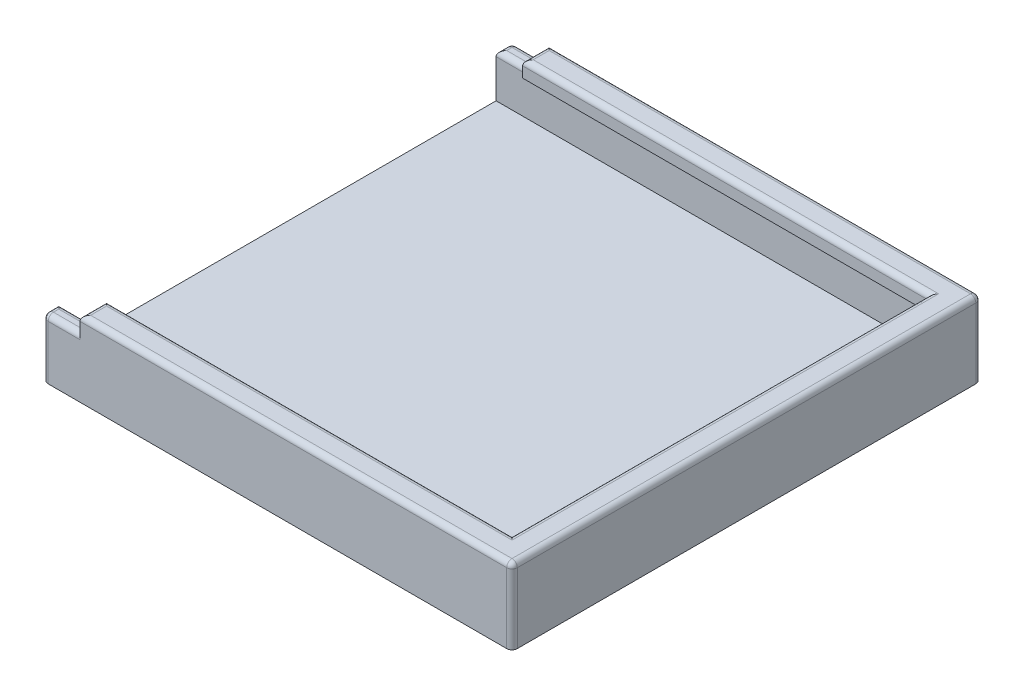
ISO-10303-21;
HEADER;
FILE_DESCRIPTION(('STEP AP214'),'2;1');
FILE_NAME('part.step','',(''),(''),'','','');
FILE_SCHEMA(('AUTOMOTIVE_DESIGN { 1 0 10303 214 1 1 1 1 }'));
ENDSEC;
DATA;
#1=APPLICATION_CONTEXT('core data for automotive mechanical design processes');
#2=APPLICATION_PROTOCOL_DEFINITION('international standard','automotive_design',2000,#1);
#3=PRODUCT_CONTEXT('',#1,'mechanical');
#4=PRODUCT('Part','Part','',(#3));
#5=PRODUCT_RELATED_PRODUCT_CATEGORY('part','',(#4));
#6=PRODUCT_DEFINITION_FORMATION('','',#4);
#7=PRODUCT_DEFINITION_CONTEXT('part definition',#1,'design');
#8=PRODUCT_DEFINITION('design','',#6,#7);
#9=PRODUCT_DEFINITION_SHAPE('','',#8);
#10=(LENGTH_UNIT() NAMED_UNIT(*) SI_UNIT(.MILLI.,.METRE.));
#11=(NAMED_UNIT(*) PLANE_ANGLE_UNIT() SI_UNIT($,.RADIAN.));
#12=(NAMED_UNIT(*) SI_UNIT($,.STERADIAN.) SOLID_ANGLE_UNIT());
#13=UNCERTAINTY_MEASURE_WITH_UNIT(LENGTH_MEASURE(1.E-05),#10,'distance_accuracy_value','');
#14=(GEOMETRIC_REPRESENTATION_CONTEXT(3) GLOBAL_UNCERTAINTY_ASSIGNED_CONTEXT((#13)) GLOBAL_UNIT_ASSIGNED_CONTEXT((#10,
#11,#12)) REPRESENTATION_CONTEXT('',''));
#15=CARTESIAN_POINT('',(0.,0.,0.));
#16=DIRECTION('',(0.,0.,1.));
#17=DIRECTION('',(1.,0.,0.));
#18=AXIS2_PLACEMENT_3D('',#15,#16,#17);
#19=CARTESIAN_POINT('',(0.,4.1,0.));
#20=DIRECTION('',(0.,1.,0.));
#21=DIRECTION('',(0.,0.,1.));
#22=AXIS2_PLACEMENT_3D('',#19,#20,#21);
#23=PLANE('',#22);
#24=DIRECTION('',(0.,0.,-1.));
#25=VECTOR('',#24,1.);
#26=CARTESIAN_POINT('',(-18.6,4.1,-20.6));
#27=LINE('',#26,#25);
#28=CARTESIAN_POINT('',(-18.6,4.1,-21.1));
#29=VERTEX_POINT('',#28);
#30=CARTESIAN_POINT('',(-18.6,4.1,-21.6));
#31=VERTEX_POINT('',#30);
#32=EDGE_CURVE('E274',#29,#31,#27,.T.);
#33=ORIENTED_EDGE('',*,*,#32,.T.);
#34=DIRECTION('',(-1.,0.,0.));
#35=VECTOR('',#34,1.);
#36=CARTESIAN_POINT('',(-22.1,4.1,-21.6));
#37=LINE('',#36,#35);
#38=CARTESIAN_POINT('',(-21.6,4.1,-21.6));
#39=VERTEX_POINT('',#38);
#40=EDGE_CURVE('E392',#31,#39,#37,.T.);
#41=ORIENTED_EDGE('',*,*,#40,.T.);
#42=DIRECTION('',(0.,0.,1.));
#43=VECTOR('',#42,1.);
#44=CARTESIAN_POINT('',(-21.6,4.1,0.));
#45=LINE('',#44,#43);
#46=CARTESIAN_POINT('',(-21.6,4.1,-21.1));
#47=VERTEX_POINT('',#46);
#48=EDGE_CURVE('E390',#39,#47,#45,.T.);
#49=ORIENTED_EDGE('',*,*,#48,.T.);
#50=DIRECTION('',(-1.,0.,0.));
#51=VECTOR('',#50,1.);
#52=CARTESIAN_POINT('',(0.,4.1,-21.1));
#53=LINE('',#52,#51);
#54=EDGE_CURVE('E388',#47,#29,#53,.F.);
#55=ORIENTED_EDGE('',*,*,#54,.T.);
#56=EDGE_LOOP('',(#33,#41,#49,#55));
#57=FACE_BOUND('',#56,.T.);
#58=ADVANCED_FACE('F37',(#57),#23,.T.);
#59=DIRECTION('',(0.,0.,1.));
#60=VECTOR('',#59,1.);
#61=CARTESIAN_POINT('',(-21.6,4.1,0.));
#62=LINE('',#61,#60);
#63=CARTESIAN_POINT('',(-21.6,4.1,21.1));
#64=VERTEX_POINT('',#63);
#65=CARTESIAN_POINT('',(-21.6,4.1,21.6));
#66=VERTEX_POINT('',#65);
#67=EDGE_CURVE('E380',#64,#66,#62,.T.);
#68=ORIENTED_EDGE('',*,*,#67,.T.);
#69=DIRECTION('',(1.,0.,0.));
#70=VECTOR('',#69,1.);
#71=CARTESIAN_POINT('',(0.,4.1,21.6));
#72=LINE('',#71,#70);
#73=CARTESIAN_POINT('',(-18.6,4.1,21.6));
#74=VERTEX_POINT('',#73);
#75=EDGE_CURVE('E382',#66,#74,#72,.T.);
#76=ORIENTED_EDGE('',*,*,#75,.T.);
#77=DIRECTION('',(0.,0.,-1.));
#78=VECTOR('',#77,1.);
#79=CARTESIAN_POINT('',(-18.6,4.1,19.6));
#80=LINE('',#79,#78);
#81=CARTESIAN_POINT('',(-18.6,4.1,21.1));
#82=VERTEX_POINT('',#81);
#83=EDGE_CURVE('E262',#74,#82,#80,.T.);
#84=ORIENTED_EDGE('',*,*,#83,.T.);
#85=DIRECTION('',(1.,0.,0.));
#86=VECTOR('',#85,1.);
#87=CARTESIAN_POINT('',(0.,4.1,21.1));
#88=LINE('',#87,#86);
#89=EDGE_CURVE('E378',#82,#64,#88,.F.);
#90=ORIENTED_EDGE('',*,*,#89,.T.);
#91=EDGE_LOOP('',(#68,#76,#84,#90));
#92=FACE_BOUND('',#91,.T.);
#93=ADVANCED_FACE('F568',(#92),#23,.T.);
#94=CARTESIAN_POINT('',(19.6,5.6,-22.1));
#95=DIRECTION('',(1.,0.,0.));
#96=DIRECTION('',(0.,0.,-1.));
#97=AXIS2_PLACEMENT_3D('',#94,#95,#96);
#98=PLANE('',#97);
#99=DIRECTION('',(0.,-1.,0.));
#100=VECTOR('',#99,1.);
#101=CARTESIAN_POINT('',(19.6,5.6,19.6));
#102=LINE('',#101,#100);
#103=CARTESIAN_POINT('',(19.6,5.1,19.6));
#104=VERTEX_POINT('',#103);
#105=CARTESIAN_POINT('',(19.6,4.1,19.6));
#106=VERTEX_POINT('',#105);
#107=EDGE_CURVE('E243',#104,#106,#102,.T.);
#108=ORIENTED_EDGE('',*,*,#107,.F.);
#109=DIRECTION('',(0.,0.,1.));
#110=VECTOR('',#109,1.);
#111=CARTESIAN_POINT('',(19.6,5.1,-22.1));
#112=LINE('',#111,#110);
#113=CARTESIAN_POINT('',(19.6,5.1,-19.6));
#114=VERTEX_POINT('',#113);
#115=EDGE_CURVE('E337',#104,#114,#112,.F.);
#116=ORIENTED_EDGE('',*,*,#115,.T.);
#117=DIRECTION('',(0.,1.,0.));
#118=VECTOR('',#117,1.);
#119=CARTESIAN_POINT('',(19.6,5.59999999999999,-19.6));
#120=LINE('',#119,#118);
#121=CARTESIAN_POINT('',(19.6,4.1,-19.6));
#122=VERTEX_POINT('',#121);
#123=EDGE_CURVE('E264',#122,#114,#120,.T.);
#124=ORIENTED_EDGE('',*,*,#123,.F.);
#125=DIRECTION('',(0.,0.,1.));
#126=VECTOR('',#125,1.);
#127=CARTESIAN_POINT('',(19.6,4.1,-22.1));
#128=LINE('',#127,#126);
#129=EDGE_CURVE('E282',#122,#106,#128,.T.);
#130=ORIENTED_EDGE('',*,*,#129,.T.);
#131=EDGE_LOOP('',(#108,#116,#124,#130));
#132=FACE_BOUND('',#131,.T.);
#133=ADVANCED_FACE('F480',(#132),#98,.F.);
#134=CARTESIAN_POINT('',(-22.1,-1.5,-22.1));
#135=DIRECTION('',(0.,0.,1.));
#136=DIRECTION('',(1.,0.,0.));
#137=AXIS2_PLACEMENT_3D('',#134,#135,#136);
#138=PLANE('',#137);
#139=DIRECTION('',(0.,1.,0.));
#140=VECTOR('',#139,1.);
#141=CARTESIAN_POINT('',(-18.6,5.6,-22.1));
#142=LINE('',#141,#140);
#143=CARTESIAN_POINT('',(-18.6,3.6,-22.1));
#144=VERTEX_POINT('',#143);
#145=CARTESIAN_POINT('',(-18.6,5.1,-22.1));
#146=VERTEX_POINT('',#145);
#147=EDGE_CURVE('E279',#144,#146,#142,.T.);
#148=ORIENTED_EDGE('',*,*,#147,.T.);
#149=DIRECTION('',(-1.,0.,0.));
#150=VECTOR('',#149,1.);
#151=CARTESIAN_POINT('',(-22.1,5.1,-22.1));
#152=LINE('',#151,#150);
#153=CARTESIAN_POINT('',(21.6,5.1,-22.1));
#154=VERTEX_POINT('',#153);
#155=EDGE_CURVE('E347',#146,#154,#152,.F.);
#156=ORIENTED_EDGE('',*,*,#155,.T.);
#157=DIRECTION('',(0.,1.,0.));
#158=VECTOR('',#157,1.);
#159=CARTESIAN_POINT('',(21.6,-1.5,-22.1));
#160=LINE('',#159,#158);
#161=CARTESIAN_POINT('',(21.6,-1.5,-22.1));
#162=VERTEX_POINT('',#161);
#163=EDGE_CURVE('E345',#154,#162,#160,.F.);
#164=ORIENTED_EDGE('',*,*,#163,.T.);
#165=DIRECTION('',(1.,0.,0.));
#166=VECTOR('',#165,1.);
#167=CARTESIAN_POINT('',(-22.1,-1.5,-22.1));
#168=LINE('',#167,#166);
#169=CARTESIAN_POINT('',(-21.6,-1.5,-22.1));
#170=VERTEX_POINT('',#169);
#171=EDGE_CURVE('E300',#170,#162,#168,.T.);
#172=ORIENTED_EDGE('',*,*,#171,.F.);
#173=DIRECTION('',(0.,1.,0.));
#174=VECTOR('',#173,1.);
#175=CARTESIAN_POINT('',(-21.6,4.1,-22.1));
#176=LINE('',#175,#174);
#177=CARTESIAN_POINT('',(-21.6,3.6,-22.1));
#178=VERTEX_POINT('',#177);
#179=EDGE_CURVE('E342',#170,#178,#176,.T.);
#180=ORIENTED_EDGE('',*,*,#179,.T.);
#181=DIRECTION('',(-1.,0.,0.));
#182=VECTOR('',#181,1.);
#183=CARTESIAN_POINT('',(-18.6,3.6,-22.1));
#184=LINE('',#183,#182);
#185=EDGE_CURVE('E339',#178,#144,#184,.F.);
#186=ORIENTED_EDGE('',*,*,#185,.T.);
#187=EDGE_LOOP('',(#148,#156,#164,#172,#180,#186));
#188=FACE_BOUND('',#187,.T.);
#189=ADVANCED_FACE('F508',(#188),#138,.F.);
#190=CARTESIAN_POINT('',(22.1,-1.5,-22.1));
#191=DIRECTION('',(-1.,0.,0.));
#192=DIRECTION('',(0.,0.,1.));
#193=AXIS2_PLACEMENT_3D('',#190,#191,#192);
#194=PLANE('',#193);
#195=DIRECTION('',(0.,0.,1.));
#196=VECTOR('',#195,1.);
#197=CARTESIAN_POINT('',(22.1,-1.5,-22.1));
#198=LINE('',#197,#196);
#199=CARTESIAN_POINT('',(22.1,-1.5,-21.6));
#200=VERTEX_POINT('',#199);
#201=CARTESIAN_POINT('',(22.1,-1.5,21.6));
#202=VERTEX_POINT('',#201);
#203=EDGE_CURVE('E303',#200,#202,#198,.T.);
#204=ORIENTED_EDGE('',*,*,#203,.F.);
#205=DIRECTION('',(0.,1.,0.));
#206=VECTOR('',#205,1.);
#207=CARTESIAN_POINT('',(22.1,-1.5,-21.6));
#208=LINE('',#207,#206);
#209=CARTESIAN_POINT('',(22.1,5.1,-21.6));
#210=VERTEX_POINT('',#209);
#211=EDGE_CURVE('E376',#200,#210,#208,.T.);
#212=ORIENTED_EDGE('',*,*,#211,.T.);
#213=DIRECTION('',(0.,0.,-1.));
#214=VECTOR('',#213,1.);
#215=CARTESIAN_POINT('',(22.1,5.1,-22.1));
#216=LINE('',#215,#214);
#217=CARTESIAN_POINT('',(22.1,5.1,21.6));
#218=VERTEX_POINT('',#217);
#219=EDGE_CURVE('E372',#210,#218,#216,.F.);
#220=ORIENTED_EDGE('',*,*,#219,.T.);
#221=DIRECTION('',(0.,1.,0.));
#222=VECTOR('',#221,1.);
#223=CARTESIAN_POINT('',(22.1,-1.5,21.6));
#224=LINE('',#223,#222);
#225=EDGE_CURVE('E374',#218,#202,#224,.F.);
#226=ORIENTED_EDGE('',*,*,#225,.T.);
#227=EDGE_LOOP('',(#204,#212,#220,#226));
#228=FACE_BOUND('',#227,.T.);
#229=ADVANCED_FACE('F581',(#228),#194,.F.);
#230=CARTESIAN_POINT('',(-22.1,-1.5,22.1));
#231=DIRECTION('',(0.,0.,1.));
#232=DIRECTION('',(1.,0.,0.));
#233=AXIS2_PLACEMENT_3D('',#230,#231,#232);
#234=PLANE('',#233);
#235=DIRECTION('',(1.,0.,0.));
#236=VECTOR('',#235,1.);
#237=CARTESIAN_POINT('',(-22.1,-1.5,22.1));
#238=LINE('',#237,#236);
#239=CARTESIAN_POINT('',(-21.6,-1.5,22.1));
#240=VERTEX_POINT('',#239);
#241=CARTESIAN_POINT('',(21.6,-1.5,22.1));
#242=VERTEX_POINT('',#241);
#243=EDGE_CURVE('E306',#240,#242,#238,.T.);
#244=ORIENTED_EDGE('',*,*,#243,.T.);
#245=DIRECTION('',(0.,1.,0.));
#246=VECTOR('',#245,1.);
#247=CARTESIAN_POINT('',(21.6,5.6,22.1));
#248=LINE('',#247,#246);
#249=CARTESIAN_POINT('',(21.6,5.1,22.1));
#250=VERTEX_POINT('',#249);
#251=EDGE_CURVE('E370',#242,#250,#248,.T.);
#252=ORIENTED_EDGE('',*,*,#251,.T.);
#253=DIRECTION('',(1.,0.,0.));
#254=VECTOR('',#253,1.);
#255=CARTESIAN_POINT('',(-18.6,5.1,22.1));
#256=LINE('',#255,#254);
#257=CARTESIAN_POINT('',(-18.6,5.1,22.1));
#258=VERTEX_POINT('',#257);
#259=EDGE_CURVE('E368',#250,#258,#256,.F.);
#260=ORIENTED_EDGE('',*,*,#259,.T.);
#261=DIRECTION('',(0.,-1.,0.));
#262=VECTOR('',#261,1.);
#263=CARTESIAN_POINT('',(-18.6,4.1,22.1));
#264=LINE('',#263,#262);
#265=CARTESIAN_POINT('',(-18.6,3.6,22.1));
#266=VERTEX_POINT('',#265);
#267=EDGE_CURVE('E261',#258,#266,#264,.T.);
#268=ORIENTED_EDGE('',*,*,#267,.T.);
#269=DIRECTION('',(1.,0.,0.));
#270=VECTOR('',#269,1.);
#271=CARTESIAN_POINT('',(-22.1,3.6,22.1));
#272=LINE('',#271,#270);
#273=CARTESIAN_POINT('',(-21.6,3.6,22.1));
#274=VERTEX_POINT('',#273);
#275=EDGE_CURVE('E364',#266,#274,#272,.F.);
#276=ORIENTED_EDGE('',*,*,#275,.T.);
#277=DIRECTION('',(0.,1.,0.));
#278=VECTOR('',#277,1.);
#279=CARTESIAN_POINT('',(-21.6,-1.5,22.1));
#280=LINE('',#279,#278);
#281=EDGE_CURVE('E366',#274,#240,#280,.F.);
#282=ORIENTED_EDGE('',*,*,#281,.T.);
#283=EDGE_LOOP('',(#244,#252,#260,#268,#276,#282));
#284=FACE_BOUND('',#283,.T.);
#285=ADVANCED_FACE('F578',(#284),#234,.T.);
#286=CARTESIAN_POINT('',(-22.1,-1.5,-22.1));
#287=DIRECTION('',(-1.,0.,0.));
#288=DIRECTION('',(0.,0.,1.));
#289=AXIS2_PLACEMENT_3D('',#286,#287,#288);
#290=PLANE('',#289);
#291=DIRECTION('',(0.,0.,1.));
#292=VECTOR('',#291,1.);
#293=CARTESIAN_POINT('',(-22.1,-1.5,-22.1));
#294=LINE('',#293,#292);
#295=CARTESIAN_POINT('',(-22.1,-1.5,-21.6));
#296=VERTEX_POINT('',#295);
#297=CARTESIAN_POINT('',(-22.1,-1.5,21.6));
#298=VERTEX_POINT('',#297);
#299=EDGE_CURVE('E309',#296,#298,#294,.T.);
#300=ORIENTED_EDGE('',*,*,#299,.T.);
#301=DIRECTION('',(0.,1.,0.));
#302=VECTOR('',#301,1.);
#303=CARTESIAN_POINT('',(-22.1,-1.5,21.6));
#304=LINE('',#303,#302);
#305=CARTESIAN_POINT('',(-22.1,3.6,21.6));
#306=VERTEX_POINT('',#305);
#307=EDGE_CURVE('E354',#298,#306,#304,.T.);
#308=ORIENTED_EDGE('',*,*,#307,.T.);
#309=DIRECTION('',(0.,0.,1.));
#310=VECTOR('',#309,1.);
#311=CARTESIAN_POINT('',(-22.1,3.6,-22.1));
#312=LINE('',#311,#310);
#313=CARTESIAN_POINT('',(-22.1,3.6,20.6));
#314=VERTEX_POINT('',#313);
#315=EDGE_CURVE('E250',#306,#314,#312,.F.);
#316=ORIENTED_EDGE('',*,*,#315,.T.);
#317=DIRECTION('',(0.,1.,0.));
#318=VECTOR('',#317,1.);
#319=CARTESIAN_POINT('',(-22.1,-1.5,20.6));
#320=LINE('',#319,#318);
#321=CARTESIAN_POINT('',(-22.1,0.,20.6));
#322=VERTEX_POINT('',#321);
#323=EDGE_CURVE('E227',#322,#314,#320,.T.);
#324=ORIENTED_EDGE('',*,*,#323,.F.);
#325=DIRECTION('',(0.,0.,1.));
#326=VECTOR('',#325,1.);
#327=CARTESIAN_POINT('',(-22.1,0.,-22.1));
#328=LINE('',#327,#326);
#329=CARTESIAN_POINT('',(-22.1,0.,-20.6));
#330=VERTEX_POINT('',#329);
#331=EDGE_CURVE('E239',#330,#322,#328,.T.);
#332=ORIENTED_EDGE('',*,*,#331,.F.);
#333=DIRECTION('',(0.,-1.,0.));
#334=VECTOR('',#333,1.);
#335=CARTESIAN_POINT('',(-22.1,-1.5,-20.6));
#336=LINE('',#335,#334);
#337=CARTESIAN_POINT('',(-22.1,3.6,-20.6));
#338=VERTEX_POINT('',#337);
#339=EDGE_CURVE('E244',#338,#330,#336,.T.);
#340=ORIENTED_EDGE('',*,*,#339,.F.);
#341=DIRECTION('',(0.,0.,1.));
#342=VECTOR('',#341,1.);
#343=CARTESIAN_POINT('',(-22.1,3.6,-22.1));
#344=LINE('',#343,#342);
#345=CARTESIAN_POINT('',(-22.1,3.6,-21.6));
#346=VERTEX_POINT('',#345);
#347=EDGE_CURVE('E349',#338,#346,#344,.F.);
#348=ORIENTED_EDGE('',*,*,#347,.T.);
#349=DIRECTION('',(0.,1.,0.));
#350=VECTOR('',#349,1.);
#351=CARTESIAN_POINT('',(-22.1,-1.5,-21.6));
#352=LINE('',#351,#350);
#353=EDGE_CURVE('E351',#346,#296,#352,.F.);
#354=ORIENTED_EDGE('',*,*,#353,.T.);
#355=EDGE_LOOP('',(#300,#308,#316,#324,#332,#340,#348,#354));
#356=FACE_BOUND('',#355,.T.);
#357=ADVANCED_FACE('F247',(#356),#290,.T.);
#358=CARTESIAN_POINT('',(0.,-1.5,0.));
#359=DIRECTION('',(0.,-1.,0.));
#360=DIRECTION('',(0.,0.,-1.));
#361=AXIS2_PLACEMENT_3D('',#358,#359,#360);
#362=PLANE('',#361);
#363=ORIENTED_EDGE('',*,*,#299,.F.);
#364=CARTESIAN_POINT('',(-21.6,-1.5,-21.6));
#365=DIRECTION('',(0.,-1.,0.));
#366=DIRECTION('',(0.,0.,-1.));
#367=AXIS2_PLACEMENT_3D('',#364,#365,#366);
#368=CIRCLE('',#367,0.5);
#369=EDGE_CURVE('E362',#296,#170,#368,.T.);
#370=ORIENTED_EDGE('',*,*,#369,.T.);
#371=ORIENTED_EDGE('',*,*,#171,.T.);
#372=CARTESIAN_POINT('',(21.6,-1.5,-21.6));
#373=DIRECTION('',(0.,-1.,0.));
#374=DIRECTION('',(0.,0.,-1.));
#375=AXIS2_PLACEMENT_3D('',#372,#373,#374);
#376=CIRCLE('',#375,0.5);
#377=EDGE_CURVE('E358',#162,#200,#376,.T.);
#378=ORIENTED_EDGE('',*,*,#377,.T.);
#379=ORIENTED_EDGE('',*,*,#203,.T.);
#380=CARTESIAN_POINT('',(21.6,-1.5,21.6));
#381=DIRECTION('',(0.,-1.,0.));
#382=DIRECTION('',(0.,0.,-1.));
#383=AXIS2_PLACEMENT_3D('',#380,#381,#382);
#384=CIRCLE('',#383,0.5);
#385=EDGE_CURVE('E356',#202,#242,#384,.T.);
#386=ORIENTED_EDGE('',*,*,#385,.T.);
#387=ORIENTED_EDGE('',*,*,#243,.F.);
#388=CARTESIAN_POINT('',(-21.6,-1.5,21.6));
#389=DIRECTION('',(0.,-1.,0.));
#390=DIRECTION('',(0.,0.,-1.));
#391=AXIS2_PLACEMENT_3D('',#388,#389,#390);
#392=CIRCLE('',#391,0.5);
#393=EDGE_CURVE('E360',#240,#298,#392,.T.);
#394=ORIENTED_EDGE('',*,*,#393,.T.);
#395=EDGE_LOOP('',(#363,#370,#371,#378,#379,#386,#387,#394));
#396=FACE_BOUND('',#395,.T.);
#397=ADVANCED_FACE('F528',(#396),#362,.T.);
#398=CARTESIAN_POINT('',(20.6,4.1,-20.6));
#399=DIRECTION('',(-1.,0.,0.));
#400=DIRECTION('',(0.,0.,1.));
#401=AXIS2_PLACEMENT_3D('',#398,#399,#400);
#402=PLANE('',#401);
#403=DIRECTION('',(0.,0.,-1.));
#404=VECTOR('',#403,1.);
#405=CARTESIAN_POINT('',(20.6,0.,-20.6));
#406=LINE('',#405,#404);
#407=CARTESIAN_POINT('',(20.6,0.,20.6));
#408=VERTEX_POINT('',#407);
#409=CARTESIAN_POINT('',(20.6,0.,-20.6));
#410=VERTEX_POINT('',#409);
#411=EDGE_CURVE('E288',#408,#410,#406,.T.);
#412=ORIENTED_EDGE('',*,*,#411,.F.);
#413=DIRECTION('',(0.,-1.,0.));
#414=VECTOR('',#413,1.);
#415=CARTESIAN_POINT('',(20.6,4.1,20.6));
#416=LINE('',#415,#414);
#417=CARTESIAN_POINT('',(20.6,4.1,20.6));
#418=VERTEX_POINT('',#417);
#419=EDGE_CURVE('E230',#418,#408,#416,.T.);
#420=ORIENTED_EDGE('',*,*,#419,.F.);
#421=DIRECTION('',(0.,0.,-1.));
#422=VECTOR('',#421,1.);
#423=CARTESIAN_POINT('',(20.6,4.1,-20.6));
#424=LINE('',#423,#422);
#425=CARTESIAN_POINT('',(20.6,4.1,-20.6));
#426=VERTEX_POINT('',#425);
#427=EDGE_CURVE('E234',#418,#426,#424,.T.);
#428=ORIENTED_EDGE('',*,*,#427,.T.);
#429=DIRECTION('',(0.,-1.,0.));
#430=VECTOR('',#429,1.);
#431=CARTESIAN_POINT('',(20.6,4.1,-20.6));
#432=LINE('',#431,#430);
#433=EDGE_CURVE('E297',#426,#410,#432,.T.);
#434=ORIENTED_EDGE('',*,*,#433,.T.);
#435=EDGE_LOOP('',(#412,#420,#428,#434));
#436=FACE_BOUND('',#435,.T.);
#437=ADVANCED_FACE('F557',(#436),#402,.T.);
#438=CARTESIAN_POINT('',(-20.6,4.1,-20.6));
#439=DIRECTION('',(0.,0.,1.));
#440=DIRECTION('',(1.,0.,0.));
#441=AXIS2_PLACEMENT_3D('',#438,#439,#440);
#442=PLANE('',#441);
#443=DIRECTION('',(0.,-1.,0.));
#444=VECTOR('',#443,1.);
#445=CARTESIAN_POINT('',(-18.6,4.1,-20.6));
#446=LINE('',#445,#444);
#447=CARTESIAN_POINT('',(-18.6,4.1,-20.6));
#448=VERTEX_POINT('',#447);
#449=CARTESIAN_POINT('',(-18.6,3.6,-20.6));
#450=VERTEX_POINT('',#449);
#451=EDGE_CURVE('E53',#448,#450,#446,.T.);
#452=ORIENTED_EDGE('',*,*,#451,.T.);
#453=DIRECTION('',(-1.,0.,0.));
#454=VECTOR('',#453,1.);
#455=CARTESIAN_POINT('',(-20.6,3.6,-20.6));
#456=LINE('',#455,#454);
#457=EDGE_CURVE('E395',#450,#338,#456,.T.);
#458=ORIENTED_EDGE('',*,*,#457,.T.);
#459=ORIENTED_EDGE('',*,*,#339,.T.);
#460=DIRECTION('',(-1.,0.,0.));
#461=VECTOR('',#460,1.);
#462=CARTESIAN_POINT('',(-20.6,0.,-20.6));
#463=LINE('',#462,#461);
#464=EDGE_CURVE('E235',#410,#330,#463,.T.);
#465=ORIENTED_EDGE('',*,*,#464,.F.);
#466=ORIENTED_EDGE('',*,*,#433,.F.);
#467=DIRECTION('',(-1.,0.,0.));
#468=VECTOR('',#467,1.);
#469=CARTESIAN_POINT('',(-20.6,4.1,-20.6));
#470=LINE('',#469,#468);
#471=EDGE_CURVE('E290',#426,#448,#470,.T.);
#472=ORIENTED_EDGE('',*,*,#471,.T.);
#473=EDGE_LOOP('',(#452,#458,#459,#465,#466,#472));
#474=FACE_BOUND('',#473,.T.);
#475=ADVANCED_FACE('F554',(#474),#442,.T.);
#476=CARTESIAN_POINT('',(-20.6,4.1,20.6));
#477=DIRECTION('',(0.,0.,-1.));
#478=DIRECTION('',(-1.,0.,0.));
#479=AXIS2_PLACEMENT_3D('',#476,#477,#478);
#480=PLANE('',#479);
#481=ORIENTED_EDGE('',*,*,#323,.T.);
#482=DIRECTION('',(1.,0.,0.));
#483=VECTOR('',#482,1.);
#484=CARTESIAN_POINT('',(-20.6,3.6,20.6));
#485=LINE('',#484,#483);
#486=CARTESIAN_POINT('',(-18.6,3.6,20.6));
#487=VERTEX_POINT('',#486);
#488=EDGE_CURVE('E386',#314,#487,#485,.T.);
#489=ORIENTED_EDGE('',*,*,#488,.T.);
#490=DIRECTION('',(0.,1.,0.));
#491=VECTOR('',#490,1.);
#492=CARTESIAN_POINT('',(-18.6,4.1,20.6));
#493=LINE('',#492,#491);
#494=CARTESIAN_POINT('',(-18.6,4.1,20.6));
#495=VERTEX_POINT('',#494);
#496=EDGE_CURVE('E384',#487,#495,#493,.T.);
#497=ORIENTED_EDGE('',*,*,#496,.T.);
#498=DIRECTION('',(1.,0.,0.));
#499=VECTOR('',#498,1.);
#500=CARTESIAN_POINT('',(-20.6,4.1,20.6));
#501=LINE('',#500,#499);
#502=EDGE_CURVE('E292',#495,#418,#501,.T.);
#503=ORIENTED_EDGE('',*,*,#502,.T.);
#504=ORIENTED_EDGE('',*,*,#419,.T.);
#505=DIRECTION('',(1.,0.,0.));
#506=VECTOR('',#505,1.);
#507=CARTESIAN_POINT('',(-20.6,0.,20.6));
#508=LINE('',#507,#506);
#509=EDGE_CURVE('E222',#322,#408,#508,.T.);
#510=ORIENTED_EDGE('',*,*,#509,.F.);
#511=EDGE_LOOP('',(#481,#489,#497,#503,#504,#510));
#512=FACE_BOUND('',#511,.T.);
#513=ADVANCED_FACE('F224',(#512),#480,.T.);
#514=CARTESIAN_POINT('',(0.,0.,0.));
#515=DIRECTION('',(0.,-1.,0.));
#516=DIRECTION('',(0.,0.,-1.));
#517=AXIS2_PLACEMENT_3D('',#514,#515,#516);
#518=PLANE('',#517);
#519=ORIENTED_EDGE('',*,*,#509,.T.);
#520=ORIENTED_EDGE('',*,*,#411,.T.);
#521=ORIENTED_EDGE('',*,*,#464,.T.);
#522=ORIENTED_EDGE('',*,*,#331,.T.);
#523=EDGE_LOOP('',(#519,#520,#521,#522));
#524=FACE_BOUND('',#523,.T.);
#525=ADVANCED_FACE('F240',(#524),#518,.F.);
#526=CARTESIAN_POINT('',(0.,4.1,0.));
#527=DIRECTION('',(0.,-1.,0.));
#528=DIRECTION('',(0.,0.,-1.));
#529=AXIS2_PLACEMENT_3D('',#526,#527,#528);
#530=PLANE('',#529);
#531=ORIENTED_EDGE('',*,*,#471,.F.);
#532=ORIENTED_EDGE('',*,*,#427,.F.);
#533=ORIENTED_EDGE('',*,*,#502,.F.);
#534=CARTESIAN_POINT('',(-18.6,4.1,19.6));
#535=VERTEX_POINT('',#534);
#536=EDGE_CURVE('E269',#495,#535,#80,.T.);
#537=ORIENTED_EDGE('',*,*,#536,.T.);
#538=DIRECTION('',(1.,0.,0.));
#539=VECTOR('',#538,1.);
#540=CARTESIAN_POINT('',(-23.5154759474227,4.1,19.6));
#541=LINE('',#540,#539);
#542=EDGE_CURVE('E266',#535,#106,#541,.T.);
#543=ORIENTED_EDGE('',*,*,#542,.T.);
#544=ORIENTED_EDGE('',*,*,#129,.F.);
#545=DIRECTION('',(1.,0.,0.));
#546=VECTOR('',#545,1.);
#547=CARTESIAN_POINT('',(-23.5154759474227,4.1,-19.6));
#548=LINE('',#547,#546);
#549=CARTESIAN_POINT('',(-18.6,4.1,-19.6));
#550=VERTEX_POINT('',#549);
#551=EDGE_CURVE('E275',#550,#122,#548,.T.);
#552=ORIENTED_EDGE('',*,*,#551,.F.);
#553=EDGE_CURVE('E276',#550,#448,#27,.T.);
#554=ORIENTED_EDGE('',*,*,#553,.T.);
#555=EDGE_LOOP('',(#531,#532,#533,#537,#543,#544,#552,#554));
#556=FACE_BOUND('',#555,.T.);
#557=ADVANCED_FACE('F467',(#556),#530,.T.);
#558=CARTESIAN_POINT('',(0.,5.6,0.));
#559=DIRECTION('',(0.,-1.,0.));
#560=DIRECTION('',(0.,0.,-1.));
#561=AXIS2_PLACEMENT_3D('',#558,#559,#560);
#562=PLANE('',#561);
#563=DIRECTION('',(1.,0.,0.));
#564=VECTOR('',#563,1.);
#565=CARTESIAN_POINT('',(0.,5.6,-20.1));
#566=LINE('',#565,#564);
#567=CARTESIAN_POINT('',(-18.1,5.6,-20.1));
#568=VERTEX_POINT('',#567);
#569=CARTESIAN_POINT('',(20.1,5.6,-20.1));
#570=VERTEX_POINT('',#569);
#571=EDGE_CURVE('E322',#568,#570,#566,.T.);
#572=ORIENTED_EDGE('',*,*,#571,.T.);
#573=DIRECTION('',(0.,0.,1.));
#574=VECTOR('',#573,1.);
#575=CARTESIAN_POINT('',(20.1,5.6,0.));
#576=LINE('',#575,#574);
#577=CARTESIAN_POINT('',(20.1,5.6,20.1));
#578=VERTEX_POINT('',#577);
#579=EDGE_CURVE('E326',#570,#578,#576,.T.);
#580=ORIENTED_EDGE('',*,*,#579,.T.);
#581=DIRECTION('',(1.,0.,0.));
#582=VECTOR('',#581,1.);
#583=CARTESIAN_POINT('',(0.,5.6,20.1));
#584=LINE('',#583,#582);
#585=CARTESIAN_POINT('',(-18.1,5.6,20.1));
#586=VERTEX_POINT('',#585);
#587=EDGE_CURVE('E324',#578,#586,#584,.F.);
#588=ORIENTED_EDGE('',*,*,#587,.T.);
#589=DIRECTION('',(0.,0.,1.));
#590=VECTOR('',#589,1.);
#591=CARTESIAN_POINT('',(-18.1,5.6,0.));
#592=LINE('',#591,#590);
#593=CARTESIAN_POINT('',(-18.1,5.6,21.6));
#594=VERTEX_POINT('',#593);
#595=EDGE_CURVE('E319',#586,#594,#592,.T.);
#596=ORIENTED_EDGE('',*,*,#595,.T.);
#597=DIRECTION('',(1.,0.,0.));
#598=VECTOR('',#597,1.);
#599=CARTESIAN_POINT('',(22.1,5.6,21.6));
#600=LINE('',#599,#598);
#601=CARTESIAN_POINT('',(21.6,5.6,21.6));
#602=VERTEX_POINT('',#601);
#603=EDGE_CURVE('E311',#594,#602,#600,.T.);
#604=ORIENTED_EDGE('',*,*,#603,.T.);
#605=DIRECTION('',(0.,0.,-1.));
#606=VECTOR('',#605,1.);
#607=CARTESIAN_POINT('',(21.6,5.6,0.));
#608=LINE('',#607,#606);
#609=CARTESIAN_POINT('',(21.6,5.6,-21.6));
#610=VERTEX_POINT('',#609);
#611=EDGE_CURVE('E313',#602,#610,#608,.T.);
#612=ORIENTED_EDGE('',*,*,#611,.T.);
#613=DIRECTION('',(-1.,0.,0.));
#614=VECTOR('',#613,1.);
#615=CARTESIAN_POINT('',(0.,5.6,-21.6));
#616=LINE('',#615,#614);
#617=CARTESIAN_POINT('',(-18.1,5.6,-21.6));
#618=VERTEX_POINT('',#617);
#619=EDGE_CURVE('E315',#610,#618,#616,.T.);
#620=ORIENTED_EDGE('',*,*,#619,.T.);
#621=DIRECTION('',(0.,0.,1.));
#622=VECTOR('',#621,1.);
#623=CARTESIAN_POINT('',(-18.1,5.6,0.));
#624=LINE('',#623,#622);
#625=EDGE_CURVE('E317',#618,#568,#624,.T.);
#626=ORIENTED_EDGE('',*,*,#625,.T.);
#627=EDGE_LOOP('',(#572,#580,#588,#596,#604,#612,#620,#626));
#628=FACE_BOUND('',#627,.T.);
#629=ADVANCED_FACE('F497',(#628),#562,.F.);
#630=CARTESIAN_POINT('',(-23.5154759474227,5.59999999999999,-19.6));
#631=DIRECTION('',(0.,0.,-1.));
#632=DIRECTION('',(0.,1.,0.));
#633=AXIS2_PLACEMENT_3D('',#630,#631,#632);
#634=PLANE('',#633);
#635=ORIENTED_EDGE('',*,*,#123,.T.);
#636=DIRECTION('',(1.,0.,0.));
#637=VECTOR('',#636,1.);
#638=CARTESIAN_POINT('',(-23.5154759474227,5.1,-19.6));
#639=LINE('',#638,#637);
#640=CARTESIAN_POINT('',(-18.6,5.1,-19.6));
#641=VERTEX_POINT('',#640);
#642=EDGE_CURVE('E335',#114,#641,#639,.F.);
#643=ORIENTED_EDGE('',*,*,#642,.T.);
#644=DIRECTION('',(0.,-1.,0.));
#645=VECTOR('',#644,1.);
#646=CARTESIAN_POINT('',(-18.6,5.59999999999999,-19.6));
#647=LINE('',#646,#645);
#648=EDGE_CURVE('E272',#641,#550,#647,.T.);
#649=ORIENTED_EDGE('',*,*,#648,.T.);
#650=ORIENTED_EDGE('',*,*,#551,.T.);
#651=EDGE_LOOP('',(#635,#643,#649,#650));
#652=FACE_BOUND('',#651,.T.);
#653=ADVANCED_FACE('F484',(#652),#634,.F.);
#654=CARTESIAN_POINT('',(-18.6,4.1,-20.6));
#655=DIRECTION('',(1.,0.,0.));
#656=DIRECTION('',(0.,0.,-1.));
#657=AXIS2_PLACEMENT_3D('',#654,#655,#656);
#658=PLANE('',#657);
#659=ORIENTED_EDGE('',*,*,#648,.F.);
#660=DIRECTION('',(0.,0.,1.));
#661=VECTOR('',#660,1.);
#662=CARTESIAN_POINT('',(-18.6,5.1,-20.6));
#663=LINE('',#662,#661);
#664=EDGE_CURVE('E331',#641,#146,#663,.F.);
#665=ORIENTED_EDGE('',*,*,#664,.T.);
#666=ORIENTED_EDGE('',*,*,#147,.F.);
#667=CARTESIAN_POINT('',(-18.6,3.6,-21.6));
#668=DIRECTION('',(1.,0.,0.));
#669=DIRECTION('',(0.,0.,-1.));
#670=AXIS2_PLACEMENT_3D('',#667,#668,#669);
#671=CIRCLE('',#670,0.5);
#672=EDGE_CURVE('E46',#144,#31,#671,.T.);
#673=ORIENTED_EDGE('',*,*,#672,.T.);
#674=ORIENTED_EDGE('',*,*,#32,.F.);
#675=CARTESIAN_POINT('',(-18.6,3.6,-21.1));
#676=DIRECTION('',(1.,0.,0.));
#677=DIRECTION('',(0.,0.,-1.));
#678=AXIS2_PLACEMENT_3D('',#675,#676,#677);
#679=CIRCLE('',#678,0.5);
#680=EDGE_CURVE('E13',#29,#450,#679,.T.);
#681=ORIENTED_EDGE('',*,*,#680,.T.);
#682=ORIENTED_EDGE('',*,*,#451,.F.);
#683=ORIENTED_EDGE('',*,*,#553,.F.);
#684=EDGE_LOOP('',(#659,#665,#666,#673,#674,#681,#682,#683));
#685=FACE_BOUND('',#684,.T.);
#686=ADVANCED_FACE('F505',(#685),#658,.F.);
#687=CARTESIAN_POINT('',(-23.5154759474227,5.6,19.6));
#688=DIRECTION('',(0.,0.,1.));
#689=DIRECTION('',(1.,0.,0.));
#690=AXIS2_PLACEMENT_3D('',#687,#688,#689);
#691=PLANE('',#690);
#692=DIRECTION('',(0.,1.,0.));
#693=VECTOR('',#692,1.);
#694=CARTESIAN_POINT('',(-18.6,5.6,19.6));
#695=LINE('',#694,#693);
#696=CARTESIAN_POINT('',(-18.6,5.1,19.6));
#697=VERTEX_POINT('',#696);
#698=EDGE_CURVE('E258',#535,#697,#695,.T.);
#699=ORIENTED_EDGE('',*,*,#698,.T.);
#700=DIRECTION('',(1.,0.,0.));
#701=VECTOR('',#700,1.);
#702=CARTESIAN_POINT('',(-23.5154759474227,5.1,19.6));
#703=LINE('',#702,#701);
#704=EDGE_CURVE('E333',#697,#104,#703,.T.);
#705=ORIENTED_EDGE('',*,*,#704,.T.);
#706=ORIENTED_EDGE('',*,*,#107,.T.);
#707=ORIENTED_EDGE('',*,*,#542,.F.);
#708=EDGE_LOOP('',(#699,#705,#706,#707));
#709=FACE_BOUND('',#708,.T.);
#710=ADVANCED_FACE('F474',(#709),#691,.F.);
#711=CARTESIAN_POINT('',(-18.6,4.1,-20.6));
#712=DIRECTION('',(1.,0.,0.));
#713=DIRECTION('',(0.,0.,-1.));
#714=AXIS2_PLACEMENT_3D('',#711,#712,#713);
#715=PLANE('',#714);
#716=ORIENTED_EDGE('',*,*,#267,.F.);
#717=DIRECTION('',(0.,0.,1.));
#718=VECTOR('',#717,1.);
#719=CARTESIAN_POINT('',(-18.6,5.1,-20.6));
#720=LINE('',#719,#718);
#721=EDGE_CURVE('E328',#258,#697,#720,.F.);
#722=ORIENTED_EDGE('',*,*,#721,.T.);
#723=ORIENTED_EDGE('',*,*,#698,.F.);
#724=ORIENTED_EDGE('',*,*,#536,.F.);
#725=ORIENTED_EDGE('',*,*,#496,.F.);
#726=CARTESIAN_POINT('',(-18.6,3.6,21.1));
#727=DIRECTION('',(1.,0.,0.));
#728=DIRECTION('',(0.,0.,-1.));
#729=AXIS2_PLACEMENT_3D('',#726,#727,#728);
#730=CIRCLE('',#729,0.5);
#731=EDGE_CURVE('E400',#487,#82,#730,.T.);
#732=ORIENTED_EDGE('',*,*,#731,.T.);
#733=ORIENTED_EDGE('',*,*,#83,.F.);
#734=CARTESIAN_POINT('',(-18.6,3.6,21.6));
#735=DIRECTION('',(1.,0.,0.));
#736=DIRECTION('',(0.,0.,-1.));
#737=AXIS2_PLACEMENT_3D('',#734,#735,#736);
#738=CIRCLE('',#737,0.5);
#739=EDGE_CURVE('E397',#74,#266,#738,.T.);
#740=ORIENTED_EDGE('',*,*,#739,.T.);
#741=EDGE_LOOP('',(#716,#722,#723,#724,#725,#732,#733,#740));
#742=FACE_BOUND('',#741,.T.);
#743=ADVANCED_FACE('F470',(#742),#715,.F.);
#744=CARTESIAN_POINT('',(0.,5.1,-21.6));
#745=DIRECTION('',(-1.,0.,0.));
#746=DIRECTION('',(0.,0.,1.));
#747=AXIS2_PLACEMENT_3D('',#744,#745,#746);
#748=CYLINDRICAL_SURFACE('',#747,0.5);
#749=CARTESIAN_POINT('',(21.6,5.1,-21.6));
#750=DIRECTION('',(1.,0.,0.));
#751=DIRECTION('',(0.,0.,-1.));
#752=AXIS2_PLACEMENT_3D('',#749,#750,#751);
#753=CIRCLE('',#752,0.5);
#754=EDGE_CURVE('E255',#154,#610,#753,.T.);
#755=ORIENTED_EDGE('',*,*,#754,.F.);
#756=ORIENTED_EDGE('',*,*,#155,.F.);
#757=CARTESIAN_POINT('',(-18.1,5.1,-21.6));
#758=DIRECTION('',(-0.707106781186547,0.,0.707106781186547));
#759=DIRECTION('',(-0.707106781186547,0.,-0.707106781186547));
#760=AXIS2_PLACEMENT_3D('',#757,#758,#759);
#761=ELLIPSE('',#760,0.707106781186547,0.5);
#762=EDGE_CURVE('E251',#618,#146,#761,.T.);
#763=ORIENTED_EDGE('',*,*,#762,.F.);
#764=ORIENTED_EDGE('',*,*,#619,.F.);
#765=EDGE_LOOP('',(#755,#756,#763,#764));
#766=FACE_BOUND('',#765,.T.);
#767=ADVANCED_FACE('F514',(#766),#748,.T.);
#768=CARTESIAN_POINT('',(21.6,-1.5,-21.6));
#769=DIRECTION('',(0.,1.,0.));
#770=DIRECTION('',(0.,0.,1.));
#771=AXIS2_PLACEMENT_3D('',#768,#769,#770);
#772=CYLINDRICAL_SURFACE('',#771,0.5);
#773=ORIENTED_EDGE('',*,*,#377,.F.);
#774=ORIENTED_EDGE('',*,*,#163,.F.);
#775=CARTESIAN_POINT('',(21.6,5.1,-21.6));
#776=DIRECTION('',(0.,1.,0.));
#777=DIRECTION('',(0.,0.,1.));
#778=AXIS2_PLACEMENT_3D('',#775,#776,#777);
#779=CIRCLE('',#778,0.5);
#780=EDGE_CURVE('E429',#210,#154,#779,.T.);
#781=ORIENTED_EDGE('',*,*,#780,.F.);
#782=ORIENTED_EDGE('',*,*,#211,.F.);
#783=EDGE_LOOP('',(#773,#774,#781,#782));
#784=FACE_BOUND('',#783,.T.);
#785=ADVANCED_FACE('F523',(#784),#772,.T.);
#786=CARTESIAN_POINT('',(-18.1,5.1,0.));
#787=DIRECTION('',(0.,0.,1.));
#788=DIRECTION('',(1.,0.,0.));
#789=AXIS2_PLACEMENT_3D('',#786,#787,#788);
#790=CYLINDRICAL_SURFACE('',#789,0.5);
#791=ORIENTED_EDGE('',*,*,#762,.T.);
#792=ORIENTED_EDGE('',*,*,#664,.F.);
#793=CARTESIAN_POINT('',(-18.1,5.1,-20.1));
#794=DIRECTION('',(0.707106781186548,0.,0.707106781186547));
#795=DIRECTION('',(0.707106781186547,0.,-0.707106781186548));
#796=AXIS2_PLACEMENT_3D('',#793,#794,#795);
#797=ELLIPSE('',#796,0.707106781186548,0.5);
#798=EDGE_CURVE('E426',#568,#641,#797,.T.);
#799=ORIENTED_EDGE('',*,*,#798,.F.);
#800=ORIENTED_EDGE('',*,*,#625,.F.);
#801=EDGE_LOOP('',(#791,#792,#799,#800));
#802=FACE_BOUND('',#801,.T.);
#803=ADVANCED_FACE('F504',(#802),#790,.T.);
#804=CARTESIAN_POINT('',(21.6,5.1,-21.6));
#805=DIRECTION('',(0.,0.,-1.));
#806=DIRECTION('',(-1.,0.,0.));
#807=AXIS2_PLACEMENT_3D('',#804,#805,#806);
#808=SPHERICAL_SURFACE('',#807,0.5);
#809=ORIENTED_EDGE('',*,*,#780,.T.);
#810=ORIENTED_EDGE('',*,*,#754,.T.);
#811=CARTESIAN_POINT('',(21.6,5.1,-21.6));
#812=DIRECTION('',(0.,0.,-1.));
#813=DIRECTION('',(-1.,0.,0.));
#814=AXIS2_PLACEMENT_3D('',#811,#812,#813);
#815=CIRCLE('',#814,0.5);
#816=EDGE_CURVE('E423',#210,#610,#815,.F.);
#817=ORIENTED_EDGE('',*,*,#816,.F.);
#818=EDGE_LOOP('',(#809,#810,#817));
#819=FACE_BOUND('',#818,.T.);
#820=ADVANCED_FACE('F518',(#819),#808,.T.);
#821=CARTESIAN_POINT('',(0.,5.1,-20.1));
#822=DIRECTION('',(1.,0.,0.));
#823=DIRECTION('',(0.,0.,-1.));
#824=AXIS2_PLACEMENT_3D('',#821,#822,#823);
#825=CYLINDRICAL_SURFACE('',#824,0.5);
#826=ORIENTED_EDGE('',*,*,#798,.T.);
#827=ORIENTED_EDGE('',*,*,#642,.F.);
#828=CARTESIAN_POINT('',(20.1,5.1,-20.1));
#829=DIRECTION('',(0.707106781186548,0.,0.707106781186547));
#830=DIRECTION('',(0.707106781186547,0.,-0.707106781186548));
#831=AXIS2_PLACEMENT_3D('',#828,#829,#830);
#832=ELLIPSE('',#831,0.707106781186547,0.5);
#833=EDGE_CURVE('E420',#570,#114,#832,.T.);
#834=ORIENTED_EDGE('',*,*,#833,.F.);
#835=ORIENTED_EDGE('',*,*,#571,.F.);
#836=EDGE_LOOP('',(#826,#827,#834,#835));
#837=FACE_BOUND('',#836,.T.);
#838=ADVANCED_FACE('F488',(#837),#825,.T.);
#839=CARTESIAN_POINT('',(21.6,5.1,0.));
#840=DIRECTION('',(0.,0.,-1.));
#841=DIRECTION('',(-1.,0.,0.));
#842=AXIS2_PLACEMENT_3D('',#839,#840,#841);
#843=CYLINDRICAL_SURFACE('',#842,0.5);
#844=ORIENTED_EDGE('',*,*,#816,.T.);
#845=ORIENTED_EDGE('',*,*,#611,.F.);
#846=CARTESIAN_POINT('',(21.6,5.1,21.6));
#847=DIRECTION('',(0.,0.,1.));
#848=DIRECTION('',(1.,0.,0.));
#849=AXIS2_PLACEMENT_3D('',#846,#847,#848);
#850=CIRCLE('',#849,0.5);
#851=EDGE_CURVE('E417',#218,#602,#850,.T.);
#852=ORIENTED_EDGE('',*,*,#851,.F.);
#853=ORIENTED_EDGE('',*,*,#219,.F.);
#854=EDGE_LOOP('',(#844,#845,#852,#853));
#855=FACE_BOUND('',#854,.T.);
#856=ADVANCED_FACE('F609',(#855),#843,.T.);
#857=CARTESIAN_POINT('',(21.6,-1.5,21.6));
#858=DIRECTION('',(0.,-1.,0.));
#859=DIRECTION('',(0.,0.,-1.));
#860=AXIS2_PLACEMENT_3D('',#857,#858,#859);
#861=CYLINDRICAL_SURFACE('',#860,0.5);
#862=ORIENTED_EDGE('',*,*,#385,.F.);
#863=ORIENTED_EDGE('',*,*,#225,.F.);
#864=CARTESIAN_POINT('',(21.6,5.1,21.6));
#865=DIRECTION('',(0.,1.,0.));
#866=DIRECTION('',(0.,0.,1.));
#867=AXIS2_PLACEMENT_3D('',#864,#865,#866);
#868=CIRCLE('',#867,0.5);
#869=EDGE_CURVE('E414',#250,#218,#868,.T.);
#870=ORIENTED_EDGE('',*,*,#869,.F.);
#871=ORIENTED_EDGE('',*,*,#251,.F.);
#872=EDGE_LOOP('',(#862,#863,#870,#871));
#873=FACE_BOUND('',#872,.T.);
#874=ADVANCED_FACE('F606',(#873),#861,.T.);
#875=CARTESIAN_POINT('',(20.1,5.1,0.));
#876=DIRECTION('',(0.,0.,1.));
#877=DIRECTION('',(1.,0.,0.));
#878=AXIS2_PLACEMENT_3D('',#875,#876,#877);
#879=CYLINDRICAL_SURFACE('',#878,0.5);
#880=ORIENTED_EDGE('',*,*,#833,.T.);
#881=ORIENTED_EDGE('',*,*,#115,.F.);
#882=CARTESIAN_POINT('',(20.1,5.1,20.1));
#883=DIRECTION('',(0.707106781186547,0.,-0.707106781186548));
#884=DIRECTION('',(0.707106781186548,0.,0.707106781186547));
#885=AXIS2_PLACEMENT_3D('',#882,#883,#884);
#886=ELLIPSE('',#885,0.707106781186547,0.5);
#887=EDGE_CURVE('E411',#578,#104,#886,.F.);
#888=ORIENTED_EDGE('',*,*,#887,.F.);
#889=ORIENTED_EDGE('',*,*,#579,.F.);
#890=EDGE_LOOP('',(#880,#881,#888,#889));
#891=FACE_BOUND('',#890,.T.);
#892=ADVANCED_FACE('F493',(#891),#879,.T.);
#893=CARTESIAN_POINT('',(21.6,5.1,21.6));
#894=DIRECTION('',(1.,0.,0.));
#895=DIRECTION('',(0.,0.,-1.));
#896=AXIS2_PLACEMENT_3D('',#893,#894,#895);
#897=SPHERICAL_SURFACE('',#896,0.5);
#898=ORIENTED_EDGE('',*,*,#869,.T.);
#899=ORIENTED_EDGE('',*,*,#851,.T.);
#900=CARTESIAN_POINT('',(21.6,5.1,21.6));
#901=DIRECTION('',(1.,0.,0.));
#902=DIRECTION('',(0.,0.,-1.));
#903=AXIS2_PLACEMENT_3D('',#900,#901,#902);
#904=CIRCLE('',#903,0.5);
#905=EDGE_CURVE('E408',#250,#602,#904,.F.);
#906=ORIENTED_EDGE('',*,*,#905,.F.);
#907=EDGE_LOOP('',(#898,#899,#906));
#908=FACE_BOUND('',#907,.T.);
#909=ADVANCED_FACE('F599',(#908),#897,.T.);
#910=CARTESIAN_POINT('',(-23.5154759474227,5.1,20.1));
#911=DIRECTION('',(1.,0.,0.));
#912=DIRECTION('',(0.,0.,-1.));
#913=AXIS2_PLACEMENT_3D('',#910,#911,#912);
#914=CYLINDRICAL_SURFACE('',#913,0.5);
#915=ORIENTED_EDGE('',*,*,#887,.T.);
#916=ORIENTED_EDGE('',*,*,#704,.F.);
#917=CARTESIAN_POINT('',(-18.1,5.1,20.1));
#918=DIRECTION('',(0.707106781186547,0.,-0.707106781186548));
#919=DIRECTION('',(0.707106781186548,0.,0.707106781186547));
#920=AXIS2_PLACEMENT_3D('',#917,#918,#919);
#921=ELLIPSE('',#920,0.707106781186547,0.5);
#922=EDGE_CURVE('E405',#586,#697,#921,.F.);
#923=ORIENTED_EDGE('',*,*,#922,.F.);
#924=ORIENTED_EDGE('',*,*,#587,.F.);
#925=EDGE_LOOP('',(#915,#916,#923,#924));
#926=FACE_BOUND('',#925,.T.);
#927=ADVANCED_FACE('F595',(#926),#914,.T.);
#928=CARTESIAN_POINT('',(0.,5.1,21.6));
#929=DIRECTION('',(-1.,0.,0.));
#930=DIRECTION('',(0.,0.,1.));
#931=AXIS2_PLACEMENT_3D('',#928,#929,#930);
#932=CYLINDRICAL_SURFACE('',#931,0.5);
#933=ORIENTED_EDGE('',*,*,#905,.T.);
#934=ORIENTED_EDGE('',*,*,#603,.F.);
#935=CARTESIAN_POINT('',(-18.1,5.1,21.6));
#936=DIRECTION('',(-0.707106781186547,0.,-0.707106781186547));
#937=DIRECTION('',(-0.707106781186547,0.,0.707106781186547));
#938=AXIS2_PLACEMENT_3D('',#935,#936,#937);
#939=ELLIPSE('',#938,0.707106781186547,0.5);
#940=EDGE_CURVE('E403',#258,#594,#939,.T.);
#941=ORIENTED_EDGE('',*,*,#940,.F.);
#942=ORIENTED_EDGE('',*,*,#259,.F.);
#943=EDGE_LOOP('',(#933,#934,#941,#942));
#944=FACE_BOUND('',#943,.T.);
#945=ADVANCED_FACE('F591',(#944),#932,.T.);
#946=CARTESIAN_POINT('',(-18.1,5.1,0.));
#947=DIRECTION('',(0.,0.,1.));
#948=DIRECTION('',(1.,0.,0.));
#949=AXIS2_PLACEMENT_3D('',#946,#947,#948);
#950=CYLINDRICAL_SURFACE('',#949,0.5);
#951=ORIENTED_EDGE('',*,*,#922,.T.);
#952=ORIENTED_EDGE('',*,*,#721,.F.);
#953=ORIENTED_EDGE('',*,*,#940,.T.);
#954=ORIENTED_EDGE('',*,*,#595,.F.);
#955=EDGE_LOOP('',(#951,#952,#953,#954));
#956=FACE_BOUND('',#955,.T.);
#957=ADVANCED_FACE('F588',(#956),#950,.T.);
#958=CARTESIAN_POINT('',(-20.6,3.6,-21.1));
#959=DIRECTION('',(-1.,0.,0.));
#960=DIRECTION('',(0.,0.,1.));
#961=AXIS2_PLACEMENT_3D('',#958,#959,#960);
#962=CYLINDRICAL_SURFACE('',#961,0.5);
#963=ORIENTED_EDGE('',*,*,#680,.F.);
#964=ORIENTED_EDGE('',*,*,#54,.F.);
#965=CARTESIAN_POINT('',(-21.6,3.6,-21.1));
#966=DIRECTION('',(-0.707106781186547,0.,-0.707106781186547));
#967=DIRECTION('',(-0.707106781186547,0.,0.707106781186547));
#968=AXIS2_PLACEMENT_3D('',#965,#966,#967);
#969=ELLIPSE('',#968,0.707106781186547,0.5);
#970=EDGE_CURVE('E406',#338,#47,#969,.T.);
#971=ORIENTED_EDGE('',*,*,#970,.F.);
#972=ORIENTED_EDGE('',*,*,#457,.F.);
#973=EDGE_LOOP('',(#963,#964,#971,#972));
#974=FACE_BOUND('',#973,.T.);
#975=ADVANCED_FACE('F548',(#974),#962,.T.);
#976=CARTESIAN_POINT('',(0.,3.6,-21.6));
#977=DIRECTION('',(1.,0.,0.));
#978=DIRECTION('',(0.,0.,-1.));
#979=AXIS2_PLACEMENT_3D('',#976,#977,#978);
#980=CYLINDRICAL_SURFACE('',#979,0.5);
#981=ORIENTED_EDGE('',*,*,#672,.F.);
#982=ORIENTED_EDGE('',*,*,#185,.F.);
#983=CARTESIAN_POINT('',(-21.6,3.6,-21.6));
#984=DIRECTION('',(-1.,0.,0.));
#985=DIRECTION('',(0.,0.,1.));
#986=AXIS2_PLACEMENT_3D('',#983,#984,#985);
#987=CIRCLE('',#986,0.5);
#988=EDGE_CURVE('E439',#39,#178,#987,.T.);
#989=ORIENTED_EDGE('',*,*,#988,.F.);
#990=ORIENTED_EDGE('',*,*,#40,.F.);
#991=EDGE_LOOP('',(#981,#982,#989,#990));
#992=FACE_BOUND('',#991,.T.);
#993=ADVANCED_FACE('F541',(#992),#980,.T.);
#994=CARTESIAN_POINT('',(-21.6,3.6,0.));
#995=DIRECTION('',(0.,0.,1.));
#996=DIRECTION('',(1.,0.,0.));
#997=AXIS2_PLACEMENT_3D('',#994,#995,#996);
#998=CYLINDRICAL_SURFACE('',#997,0.5);
#999=ORIENTED_EDGE('',*,*,#970,.T.);
#1000=ORIENTED_EDGE('',*,*,#48,.F.);
#1001=CARTESIAN_POINT('',(-21.6,3.6,-21.6));
#1002=DIRECTION('',(0.,0.,-1.));
#1003=DIRECTION('',(-1.,0.,0.));
#1004=AXIS2_PLACEMENT_3D('',#1001,#1002,#1003);
#1005=CIRCLE('',#1004,0.5);
#1006=EDGE_CURVE('E436',#346,#39,#1005,.T.);
#1007=ORIENTED_EDGE('',*,*,#1006,.F.);
#1008=ORIENTED_EDGE('',*,*,#347,.F.);
#1009=EDGE_LOOP('',(#999,#1000,#1007,#1008));
#1010=FACE_BOUND('',#1009,.T.);
#1011=ADVANCED_FACE('F552',(#1010),#998,.T.);
#1012=CARTESIAN_POINT('',(-21.6,3.6,-21.6));
#1013=DIRECTION('',(0.,1.,0.));
#1014=DIRECTION('',(0.,0.,1.));
#1015=AXIS2_PLACEMENT_3D('',#1012,#1013,#1014);
#1016=SPHERICAL_SURFACE('',#1015,0.5);
#1017=ORIENTED_EDGE('',*,*,#1006,.T.);
#1018=ORIENTED_EDGE('',*,*,#988,.T.);
#1019=CARTESIAN_POINT('',(-21.6,3.6,-21.6));
#1020=DIRECTION('',(0.,1.,0.));
#1021=DIRECTION('',(0.,0.,1.));
#1022=AXIS2_PLACEMENT_3D('',#1019,#1020,#1021);
#1023=CIRCLE('',#1022,0.5);
#1024=EDGE_CURVE('E434',#346,#178,#1023,.F.);
#1025=ORIENTED_EDGE('',*,*,#1024,.F.);
#1026=EDGE_LOOP('',(#1017,#1018,#1025));
#1027=FACE_BOUND('',#1026,.T.);
#1028=ADVANCED_FACE('F537',(#1027),#1016,.T.);
#1029=CARTESIAN_POINT('',(-21.6,-1.5,-21.6));
#1030=DIRECTION('',(0.,-1.,0.));
#1031=DIRECTION('',(0.,0.,-1.));
#1032=AXIS2_PLACEMENT_3D('',#1029,#1030,#1031);
#1033=CYLINDRICAL_SURFACE('',#1032,0.5);
#1034=ORIENTED_EDGE('',*,*,#369,.F.);
#1035=ORIENTED_EDGE('',*,*,#353,.F.);
#1036=ORIENTED_EDGE('',*,*,#1024,.T.);
#1037=ORIENTED_EDGE('',*,*,#179,.F.);
#1038=EDGE_LOOP('',(#1034,#1035,#1036,#1037));
#1039=FACE_BOUND('',#1038,.T.);
#1040=ADVANCED_FACE('F533',(#1039),#1033,.T.);
#1041=CARTESIAN_POINT('',(-20.6,3.6,21.1));
#1042=DIRECTION('',(1.,0.,0.));
#1043=DIRECTION('',(0.,0.,-1.));
#1044=AXIS2_PLACEMENT_3D('',#1041,#1042,#1043);
#1045=CYLINDRICAL_SURFACE('',#1044,0.5);
#1046=ORIENTED_EDGE('',*,*,#731,.F.);
#1047=ORIENTED_EDGE('',*,*,#488,.F.);
#1048=CARTESIAN_POINT('',(-21.6,3.6,21.1));
#1049=DIRECTION('',(0.707106781186547,0.,-0.707106781186547));
#1050=DIRECTION('',(0.707106781186547,0.,0.707106781186547));
#1051=AXIS2_PLACEMENT_3D('',#1048,#1049,#1050);
#1052=ELLIPSE('',#1051,0.707106781186547,0.5);
#1053=EDGE_CURVE('E41',#64,#314,#1052,.F.);
#1054=ORIENTED_EDGE('',*,*,#1053,.F.);
#1055=ORIENTED_EDGE('',*,*,#89,.F.);
#1056=EDGE_LOOP('',(#1046,#1047,#1054,#1055));
#1057=FACE_BOUND('',#1056,.T.);
#1058=ADVANCED_FACE('F39',(#1057),#1045,.T.);
#1059=CARTESIAN_POINT('',(-21.6,3.6,0.));
#1060=DIRECTION('',(0.,0.,1.));
#1061=DIRECTION('',(1.,0.,0.));
#1062=AXIS2_PLACEMENT_3D('',#1059,#1060,#1061);
#1063=CYLINDRICAL_SURFACE('',#1062,0.5);
#1064=ORIENTED_EDGE('',*,*,#1053,.T.);
#1065=ORIENTED_EDGE('',*,*,#315,.F.);
#1066=CARTESIAN_POINT('',(-21.6,3.6,21.6));
#1067=DIRECTION('',(0.,0.,1.));
#1068=DIRECTION('',(1.,0.,0.));
#1069=AXIS2_PLACEMENT_3D('',#1066,#1067,#1068);
#1070=CIRCLE('',#1069,0.5);
#1071=EDGE_CURVE('E448',#66,#306,#1070,.T.);
#1072=ORIENTED_EDGE('',*,*,#1071,.F.);
#1073=ORIENTED_EDGE('',*,*,#67,.F.);
#1074=EDGE_LOOP('',(#1064,#1065,#1072,#1073));
#1075=FACE_BOUND('',#1074,.T.);
#1076=ADVANCED_FACE('F457',(#1075),#1063,.T.);
#1077=CARTESIAN_POINT('',(0.,3.6,21.6));
#1078=DIRECTION('',(1.,0.,0.));
#1079=DIRECTION('',(0.,0.,-1.));
#1080=AXIS2_PLACEMENT_3D('',#1077,#1078,#1079);
#1081=CYLINDRICAL_SURFACE('',#1080,0.5);
#1082=ORIENTED_EDGE('',*,*,#739,.F.);
#1083=ORIENTED_EDGE('',*,*,#75,.F.);
#1084=CARTESIAN_POINT('',(-21.6,3.6,21.6));
#1085=DIRECTION('',(-1.,0.,0.));
#1086=DIRECTION('',(0.,0.,1.));
#1087=AXIS2_PLACEMENT_3D('',#1084,#1085,#1086);
#1088=CIRCLE('',#1087,0.5);
#1089=EDGE_CURVE('E446',#274,#66,#1088,.T.);
#1090=ORIENTED_EDGE('',*,*,#1089,.F.);
#1091=ORIENTED_EDGE('',*,*,#275,.F.);
#1092=EDGE_LOOP('',(#1082,#1083,#1090,#1091));
#1093=FACE_BOUND('',#1092,.T.);
#1094=ADVANCED_FACE('F641',(#1093),#1081,.T.);
#1095=CARTESIAN_POINT('',(-21.6,3.6,21.6));
#1096=DIRECTION('',(0.,1.,0.));
#1097=DIRECTION('',(0.,0.,1.));
#1098=AXIS2_PLACEMENT_3D('',#1095,#1096,#1097);
#1099=SPHERICAL_SURFACE('',#1098,0.5);
#1100=ORIENTED_EDGE('',*,*,#1089,.T.);
#1101=ORIENTED_EDGE('',*,*,#1071,.T.);
#1102=CARTESIAN_POINT('',(-21.6,3.6,21.6));
#1103=DIRECTION('',(0.,1.,0.));
#1104=DIRECTION('',(0.,0.,1.));
#1105=AXIS2_PLACEMENT_3D('',#1102,#1103,#1104);
#1106=CIRCLE('',#1105,0.5);
#1107=EDGE_CURVE('E444',#274,#306,#1106,.F.);
#1108=ORIENTED_EDGE('',*,*,#1107,.F.);
#1109=EDGE_LOOP('',(#1100,#1101,#1108));
#1110=FACE_BOUND('',#1109,.T.);
#1111=ADVANCED_FACE('F637',(#1110),#1099,.T.);
#1112=CARTESIAN_POINT('',(-21.6,-1.5,21.6));
#1113=DIRECTION('',(0.,1.,0.));
#1114=DIRECTION('',(0.,0.,1.));
#1115=AXIS2_PLACEMENT_3D('',#1112,#1113,#1114);
#1116=CYLINDRICAL_SURFACE('',#1115,0.5);
#1117=ORIENTED_EDGE('',*,*,#393,.F.);
#1118=ORIENTED_EDGE('',*,*,#281,.F.);
#1119=ORIENTED_EDGE('',*,*,#1107,.T.);
#1120=ORIENTED_EDGE('',*,*,#307,.F.);
#1121=EDGE_LOOP('',(#1117,#1118,#1119,#1120));
#1122=FACE_BOUND('',#1121,.T.);
#1123=ADVANCED_FACE('F634',(#1122),#1116,.T.);
#1124=CLOSED_SHELL('',(#58,#93,#133,#189,#229,#285,#357,#397,#437,#475,#513,#525,#557,#629,#653,
#686,#710,#743,#767,#785,#803,#820,#838,#856,#874,#892,#909,#927,#945,#957,#975,#993,#1011,
#1028,#1040,#1058,#1076,#1094,#1111,#1123));
#1125=MANIFOLD_SOLID_BREP('B2',#1124);
#1126=ADVANCED_BREP_SHAPE_REPRESENTATION('',(#18,#1125),#14);
#1127=SHAPE_DEFINITION_REPRESENTATION(#9,#1126);
ENDSEC;
END-ISO-10303-21;
